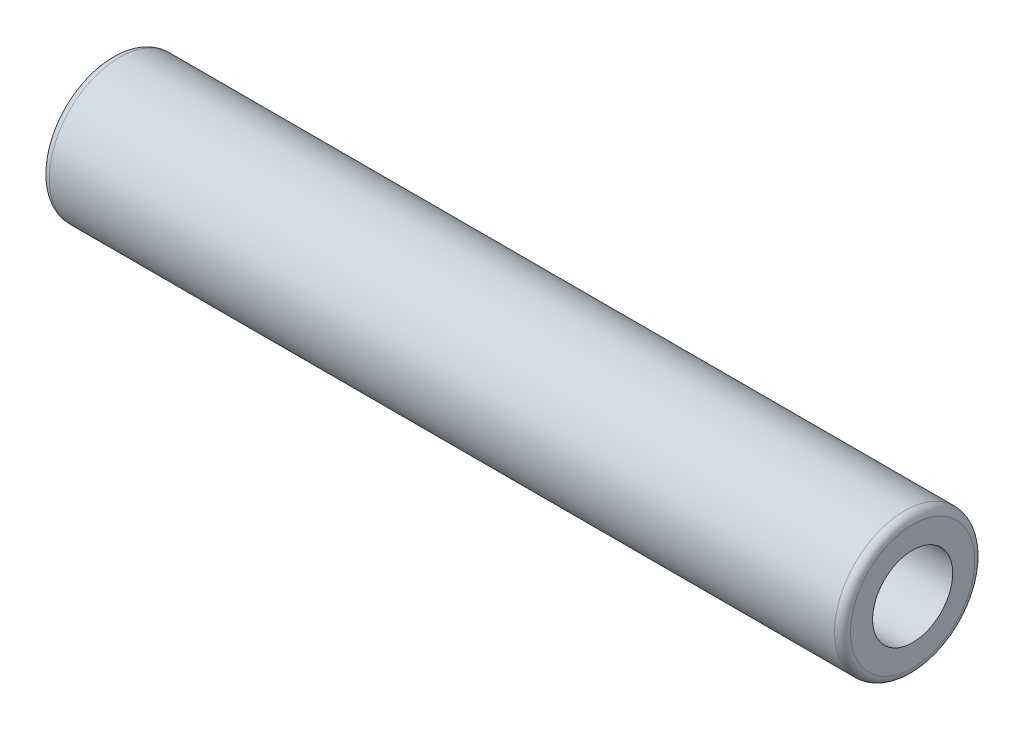
ISO-10303-21;
HEADER;
FILE_DESCRIPTION(('STEP AP214'),'2;1');
FILE_NAME('part.step','',(''),(''),'','','');
FILE_SCHEMA(('AUTOMOTIVE_DESIGN { 1 0 10303 214 1 1 1 1 }'));
ENDSEC;
DATA;
#1=APPLICATION_CONTEXT('core data for automotive mechanical design processes');
#2=APPLICATION_PROTOCOL_DEFINITION('international standard','automotive_design',2000,#1);
#3=PRODUCT_CONTEXT('',#1,'mechanical');
#4=PRODUCT('Part','Part','',(#3));
#5=PRODUCT_RELATED_PRODUCT_CATEGORY('part','',(#4));
#6=PRODUCT_DEFINITION_FORMATION('','',#4);
#7=PRODUCT_DEFINITION_CONTEXT('part definition',#1,'design');
#8=PRODUCT_DEFINITION('design','',#6,#7);
#9=PRODUCT_DEFINITION_SHAPE('','',#8);
#10=(LENGTH_UNIT() NAMED_UNIT(*) SI_UNIT(.MILLI.,.METRE.));
#11=(NAMED_UNIT(*) PLANE_ANGLE_UNIT() SI_UNIT($,.RADIAN.));
#12=(NAMED_UNIT(*) SI_UNIT($,.STERADIAN.) SOLID_ANGLE_UNIT());
#13=UNCERTAINTY_MEASURE_WITH_UNIT(LENGTH_MEASURE(1.E-05),#10,'distance_accuracy_value','');
#14=(GEOMETRIC_REPRESENTATION_CONTEXT(3) GLOBAL_UNCERTAINTY_ASSIGNED_CONTEXT((#13)) GLOBAL_UNIT_ASSIGNED_CONTEXT((#10,
#11,#12)) REPRESENTATION_CONTEXT('',''));
#15=CARTESIAN_POINT('',(0.,0.,0.));
#16=DIRECTION('',(0.,0.,1.));
#17=DIRECTION('',(1.,0.,0.));
#18=AXIS2_PLACEMENT_3D('',#15,#16,#17);
#19=CARTESIAN_POINT('',(0.,28.5810249758669,15.0832841791015));
#20=DIRECTION('',(1.,0.,0.));
#21=DIRECTION('',(0.,-0.90630778703665,-0.4226182617407));
#22=AXIS2_PLACEMENT_3D('',#19,#20,#21);
#23=CYLINDRICAL_SURFACE('',#22,1.);
#24=CARTESIAN_POINT('',(10.,28.5810249758669,15.0832841791015));
#25=DIRECTION('',(-1.,0.,0.));
#26=DIRECTION('',(0.,-0.90630778703665,-0.4226182617407));
#27=AXIS2_PLACEMENT_3D('',#24,#25,#26);
#28=CIRCLE('',#27,1.);
#29=CARTESIAN_POINT('',(10.,29.4873327629036,15.5059024408422));
#30=VERTEX_POINT('',#29);
#31=EDGE_CURVE('E52',#30,#30,#28,.T.);
#32=ORIENTED_EDGE('',*,*,#31,.F.);
#33=DIRECTION('',(-1.,0.,0.));
#34=VECTOR('',#33,1.);
#35=CARTESIAN_POINT('',(0.,29.4873327629036,15.5059024408422));
#36=LINE('',#35,#34);
#37=CARTESIAN_POINT('',(-10.,29.4873327629036,15.5059024408422));
#38=VERTEX_POINT('',#37);
#39=EDGE_CURVE('E11',#30,#38,#36,.T.);
#40=ORIENTED_EDGE('',*,*,#39,.T.);
#41=CARTESIAN_POINT('',(-10.,28.5810249758669,15.0832841791015));
#42=DIRECTION('',(1.,0.,0.));
#43=DIRECTION('',(0.,-0.90630778703665,-0.4226182617407));
#44=AXIS2_PLACEMENT_3D('',#41,#42,#43);
#45=CIRCLE('',#44,1.);
#46=EDGE_CURVE('E99',#38,#38,#45,.T.);
#47=ORIENTED_EDGE('',*,*,#46,.F.);
#48=ORIENTED_EDGE('',*,*,#39,.F.);
#49=EDGE_LOOP('',(#32,#40,#47,#48));
#50=FACE_BOUND('',#49,.T.);
#51=ADVANCED_FACE('F42',(#50),#23,.F.);
#52=CARTESIAN_POINT('',(10.,28.5810249758669,15.0832841791015));
#53=DIRECTION('',(1.,0.,0.));
#54=DIRECTION('',(0.,1.,0.));
#55=AXIS2_PLACEMENT_3D('',#52,#53,#54);
#56=PLANE('',#55);
#57=ORIENTED_EDGE('',*,*,#31,.T.);
#58=EDGE_LOOP('',(#57));
#59=FACE_BOUND('',#58,.T.);
#60=CARTESIAN_POINT('',(10.,28.5810249758669,15.0832841791015));
#61=DIRECTION('',(-1.,0.,0.));
#62=DIRECTION('',(0.,-0.90630778703665,-0.4226182617407));
#63=AXIS2_PLACEMENT_3D('',#60,#61,#62);
#64=CIRCLE('',#63,1.55);
#65=CARTESIAN_POINT('',(10.,29.9858020457737,15.7383424847996));
#66=VERTEX_POINT('',#65);
#67=EDGE_CURVE('E96',#66,#66,#64,.T.);
#68=ORIENTED_EDGE('',*,*,#67,.F.);
#69=EDGE_LOOP('',(#68));
#70=FACE_BOUND('',#69,.T.);
#71=ADVANCED_FACE('F106',(#59,#70),#56,.T.);
#72=CARTESIAN_POINT('',(9.8,28.5810249758669,15.0832841791015));
#73=DIRECTION('',(1.,0.,0.));
#74=DIRECTION('',(0.,-0.90630778703665,-0.4226182617407));
#75=AXIS2_PLACEMENT_3D('',#72,#73,#74);
#76=TOROIDAL_SURFACE('',#75,1.55,0.2);
#77=ORIENTED_EDGE('',*,*,#67,.T.);
#78=CARTESIAN_POINT('',(9.8,29.9858020457737,15.7383424847996));
#79=DIRECTION('',(0.,-0.4226182617407,0.90630778703665));
#80=DIRECTION('',(0.,0.90630778703665,0.4226182617407));
#81=AXIS2_PLACEMENT_3D('',#78,#79,#80);
#82=CIRCLE('',#81,0.2);
#83=CARTESIAN_POINT('',(9.8,30.1670636031811,15.8228661371478));
#84=VERTEX_POINT('',#83);
#85=EDGE_CURVE('E94',#66,#84,#82,.T.);
#86=ORIENTED_EDGE('',*,*,#85,.T.);
#87=CARTESIAN_POINT('',(9.8,28.5810249758669,15.0832841791015));
#88=DIRECTION('',(1.,0.,0.));
#89=DIRECTION('',(0.,-0.90630778703665,-0.4226182617407));
#90=AXIS2_PLACEMENT_3D('',#87,#88,#89);
#91=CIRCLE('',#90,1.75);
#92=EDGE_CURVE('E87',#84,#84,#91,.T.);
#93=ORIENTED_EDGE('',*,*,#92,.T.);
#94=ORIENTED_EDGE('',*,*,#85,.F.);
#95=EDGE_LOOP('',(#77,#86,#93,#94));
#96=FACE_BOUND('',#95,.T.);
#97=ADVANCED_FACE('F44',(#96),#76,.T.);
#98=CARTESIAN_POINT('',(-10.,28.5810249758669,15.0832841791015));
#99=DIRECTION('',(1.,0.,0.));
#100=DIRECTION('',(0.,1.,0.));
#101=AXIS2_PLACEMENT_3D('',#98,#99,#100);
#102=PLANE('',#101);
#103=ORIENTED_EDGE('',*,*,#46,.T.);
#104=EDGE_LOOP('',(#103));
#105=FACE_BOUND('',#104,.T.);
#106=CARTESIAN_POINT('',(-10.,28.5810249758669,15.0832841791015));
#107=DIRECTION('',(1.,0.,0.));
#108=DIRECTION('',(0.,-0.90630778703665,-0.4226182617407));
#109=AXIS2_PLACEMENT_3D('',#106,#107,#108);
#110=CIRCLE('',#109,1.55);
#111=CARTESIAN_POINT('',(-10.,27.1762479059601,14.4282258734034));
#112=VERTEX_POINT('',#111);
#113=EDGE_CURVE('E92',#112,#112,#110,.T.);
#114=ORIENTED_EDGE('',*,*,#113,.F.);
#115=EDGE_LOOP('',(#114));
#116=FACE_BOUND('',#115,.T.);
#117=ADVANCED_FACE('F109',(#105,#116),#102,.F.);
#118=CARTESIAN_POINT('',(0.,28.5810249758669,15.0832841791015));
#119=DIRECTION('',(1.,0.,0.));
#120=DIRECTION('',(0.,-0.90630778703665,-0.4226182617407));
#121=AXIS2_PLACEMENT_3D('',#118,#119,#120);
#122=CYLINDRICAL_SURFACE('',#121,1.75);
#123=ORIENTED_EDGE('',*,*,#92,.F.);
#124=DIRECTION('',(-1.,0.,0.));
#125=VECTOR('',#124,1.);
#126=CARTESIAN_POINT('',(0.,30.1670636031811,15.8228661371478));
#127=LINE('',#126,#125);
#128=CARTESIAN_POINT('',(-9.8,30.1670636031811,15.8228661371478));
#129=VERTEX_POINT('',#128);
#130=EDGE_CURVE('E76',#84,#129,#127,.T.);
#131=ORIENTED_EDGE('',*,*,#130,.T.);
#132=CARTESIAN_POINT('',(-9.8,28.5810249758669,15.0832841791015));
#133=DIRECTION('',(-1.,0.,0.));
#134=DIRECTION('',(0.,-0.90630778703665,-0.4226182617407));
#135=AXIS2_PLACEMENT_3D('',#132,#133,#134);
#136=CIRCLE('',#135,1.75);
#137=CARTESIAN_POINT('',(-9.8,26.9949863485528,14.3437022210553));
#138=VERTEX_POINT('',#137);
#139=EDGE_CURVE('E86',#138,#129,#136,.T.);
#140=ORIENTED_EDGE('',*,*,#139,.F.);
#141=CARTESIAN_POINT('',(-9.8,28.5810249758669,15.0832841791015));
#142=DIRECTION('',(-1.,0.,0.));
#143=DIRECTION('',(0.,-0.90630778703665,-0.4226182617407));
#144=AXIS2_PLACEMENT_3D('',#141,#142,#143);
#145=CIRCLE('',#144,1.75);
#146=EDGE_CURVE('E82',#129,#138,#145,.T.);
#147=ORIENTED_EDGE('',*,*,#146,.F.);
#148=ORIENTED_EDGE('',*,*,#130,.F.);
#149=EDGE_LOOP('',(#123,#131,#140,#147,#148));
#150=FACE_BOUND('',#149,.T.);
#151=ADVANCED_FACE('F89',(#150),#122,.T.);
#152=CARTESIAN_POINT('',(-9.8,28.5810249758669,15.0832841791015));
#153=DIRECTION('',(-1.,0.,0.));
#154=DIRECTION('',(0.,0.90630778703665,0.4226182617407));
#155=AXIS2_PLACEMENT_3D('',#152,#153,#154);
#156=TOROIDAL_SURFACE('',#155,1.55,0.2);
#157=ORIENTED_EDGE('',*,*,#113,.T.);
#158=CARTESIAN_POINT('',(-9.8,27.1762479059601,14.4282258734034));
#159=DIRECTION('',(0.,-0.4226182617407,0.90630778703665));
#160=DIRECTION('',(0.,-0.90630778703665,-0.4226182617407));
#161=AXIS2_PLACEMENT_3D('',#158,#159,#160);
#162=CIRCLE('',#161,0.2);
#163=EDGE_CURVE('E46',#112,#138,#162,.T.);
#164=ORIENTED_EDGE('',*,*,#163,.T.);
#165=ORIENTED_EDGE('',*,*,#139,.T.);
#166=ORIENTED_EDGE('',*,*,#146,.T.);
#167=ORIENTED_EDGE('',*,*,#163,.F.);
#168=EDGE_LOOP('',(#157,#164,#165,#166,#167));
#169=FACE_BOUND('',#168,.T.);
#170=ADVANCED_FACE('F84',(#169),#156,.T.);
#171=CLOSED_SHELL('',(#51,#71,#97,#117,#151,#170));
#172=MANIFOLD_SOLID_BREP('B2',#171);
#173=ADVANCED_BREP_SHAPE_REPRESENTATION('',(#18,#172),#14);
#174=SHAPE_DEFINITION_REPRESENTATION(#9,#173);
ENDSEC;
END-ISO-10303-21;
